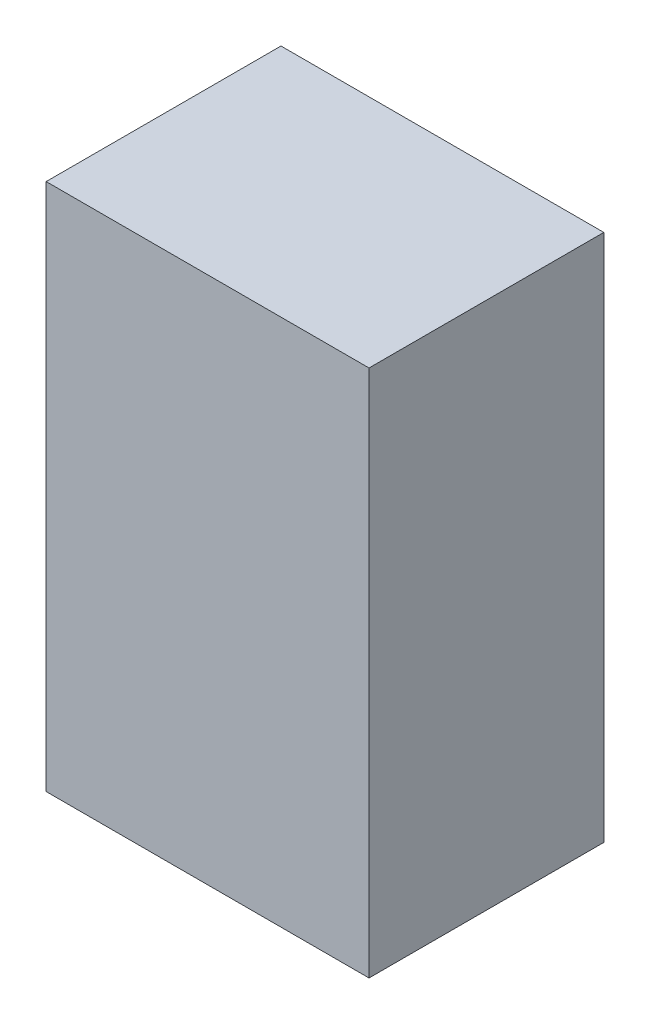
ISO-10303-21;
HEADER;
FILE_DESCRIPTION(('STEP AP214'),'2;1');
FILE_NAME('part.step','',(''),(''),'','','');
FILE_SCHEMA(('AUTOMOTIVE_DESIGN { 1 0 10303 214 1 1 1 1 }'));
ENDSEC;
DATA;
#1=APPLICATION_CONTEXT('core data for automotive mechanical design processes');
#2=APPLICATION_PROTOCOL_DEFINITION('international standard','automotive_design',2000,#1);
#3=PRODUCT_CONTEXT('',#1,'mechanical');
#4=PRODUCT('Part','Part','',(#3));
#5=PRODUCT_RELATED_PRODUCT_CATEGORY('part','',(#4));
#6=PRODUCT_DEFINITION_FORMATION('','',#4);
#7=PRODUCT_DEFINITION_CONTEXT('part definition',#1,'design');
#8=PRODUCT_DEFINITION('design','',#6,#7);
#9=PRODUCT_DEFINITION_SHAPE('','',#8);
#10=(LENGTH_UNIT() NAMED_UNIT(*) SI_UNIT(.MILLI.,.METRE.));
#11=(NAMED_UNIT(*) PLANE_ANGLE_UNIT() SI_UNIT($,.RADIAN.));
#12=(NAMED_UNIT(*) SI_UNIT($,.STERADIAN.) SOLID_ANGLE_UNIT());
#13=UNCERTAINTY_MEASURE_WITH_UNIT(LENGTH_MEASURE(1.E-05),#10,'distance_accuracy_value','');
#14=(GEOMETRIC_REPRESENTATION_CONTEXT(3) GLOBAL_UNCERTAINTY_ASSIGNED_CONTEXT((#13)) GLOBAL_UNIT_ASSIGNED_CONTEXT((#10,
#11,#12)) REPRESENTATION_CONTEXT('',''));
#15=CARTESIAN_POINT('',(0.,0.,0.));
#16=DIRECTION('',(0.,0.,1.));
#17=DIRECTION('',(1.,0.,0.));
#18=AXIS2_PLACEMENT_3D('',#15,#16,#17);
#19=CARTESIAN_POINT('',(0.,0.,7.62));
#20=DIRECTION('',(0.,0.,1.));
#21=DIRECTION('',(1.,0.,0.));
#22=AXIS2_PLACEMENT_3D('',#19,#20,#21);
#23=PLANE('',#22);
#24=DIRECTION('',(0.,-1.,0.));
#25=VECTOR('',#24,1.);
#26=CARTESIAN_POINT('',(1.27000000000001,30.95625,7.62));
#27=LINE('',#26,#25);
#28=CARTESIAN_POINT('',(1.27000000000001,36.03625,7.62));
#29=VERTEX_POINT('',#28);
#30=CARTESIAN_POINT('',(1.27000000000001,-55.40375,7.61999999999999));
#31=VERTEX_POINT('',#30);
#32=EDGE_CURVE('E97',#29,#31,#27,.T.);
#33=ORIENTED_EDGE('',*,*,#32,.F.);
#34=DIRECTION('',(1.,0.,0.));
#35=VECTOR('',#34,1.);
#36=CARTESIAN_POINT('',(-54.61,36.03625,7.62));
#37=LINE('',#36,#35);
#38=CARTESIAN_POINT('',(-54.61,36.03625,7.62));
#39=VERTEX_POINT('',#38);
#40=EDGE_CURVE('E133',#39,#29,#37,.T.);
#41=ORIENTED_EDGE('',*,*,#40,.F.);
#42=DIRECTION('',(0.,1.,0.));
#43=VECTOR('',#42,1.);
#44=CARTESIAN_POINT('',(-54.61,30.95625,7.62));
#45=LINE('',#44,#43);
#46=CARTESIAN_POINT('',(-54.61,-55.40375,7.61999999999999));
#47=VERTEX_POINT('',#46);
#48=EDGE_CURVE('E112',#47,#39,#45,.T.);
#49=ORIENTED_EDGE('',*,*,#48,.F.);
#50=DIRECTION('',(-1.,0.,0.));
#51=VECTOR('',#50,1.);
#52=CARTESIAN_POINT('',(1.27000000000001,-55.40375,7.61999999999999));
#53=LINE('',#52,#51);
#54=EDGE_CURVE('E111',#31,#47,#53,.T.);
#55=ORIENTED_EDGE('',*,*,#54,.F.);
#56=EDGE_LOOP('',(#33,#41,#49,#55));
#57=FACE_BOUND('',#56,.T.);
#58=ADVANCED_FACE('F34',(#57),#23,.T.);
#59=CARTESIAN_POINT('',(0.,0.,0.));
#60=DIRECTION('',(0.,0.,1.));
#61=DIRECTION('',(1.,0.,0.));
#62=AXIS2_PLACEMENT_3D('',#59,#60,#61);
#63=PLANE('',#62);
#64=DIRECTION('',(0.,-1.,0.));
#65=VECTOR('',#64,1.);
#66=CARTESIAN_POINT('',(-49.53,30.95625,0.));
#67=LINE('',#66,#65);
#68=CARTESIAN_POINT('',(-49.53,30.95625,0.));
#69=VERTEX_POINT('',#68);
#70=CARTESIAN_POINT('',(-49.53,-50.32375,0.));
#71=VERTEX_POINT('',#70);
#72=EDGE_CURVE('E49',#69,#71,#67,.T.);
#73=ORIENTED_EDGE('',*,*,#72,.F.);
#74=DIRECTION('',(-1.,0.,0.));
#75=VECTOR('',#74,1.);
#76=CARTESIAN_POINT('',(-49.53,30.95625,0.));
#77=LINE('',#76,#75);
#78=CARTESIAN_POINT('',(-3.80999999999999,30.95625,0.));
#79=VERTEX_POINT('',#78);
#80=EDGE_CURVE('E11',#79,#69,#77,.T.);
#81=ORIENTED_EDGE('',*,*,#80,.F.);
#82=DIRECTION('',(0.,1.,0.));
#83=VECTOR('',#82,1.);
#84=CARTESIAN_POINT('',(-3.80999999999999,30.95625,0.));
#85=LINE('',#84,#83);
#86=CARTESIAN_POINT('',(-3.80999999999999,-50.32375,0.));
#87=VERTEX_POINT('',#86);
#88=EDGE_CURVE('E42',#87,#79,#85,.T.);
#89=ORIENTED_EDGE('',*,*,#88,.F.);
#90=DIRECTION('',(1.,0.,0.));
#91=VECTOR('',#90,1.);
#92=CARTESIAN_POINT('',(-49.53,-50.32375,0.));
#93=LINE('',#92,#91);
#94=EDGE_CURVE('E161',#71,#87,#93,.T.);
#95=ORIENTED_EDGE('',*,*,#94,.F.);
#96=EDGE_LOOP('',(#73,#81,#89,#95));
#97=FACE_BOUND('',#96,.T.);
#98=ADVANCED_FACE('F36',(#97),#63,.F.);
#99=CARTESIAN_POINT('',(-54.61,30.95625,-33.02));
#100=DIRECTION('',(0.,0.,1.));
#101=DIRECTION('',(1.,0.,0.));
#102=AXIS2_PLACEMENT_3D('',#99,#100,#101);
#103=PLANE('',#102);
#104=DIRECTION('',(1.,0.,0.));
#105=VECTOR('',#104,1.);
#106=CARTESIAN_POINT('',(1.27000000000001,-50.32375,-33.02));
#107=LINE('',#106,#105);
#108=CARTESIAN_POINT('',(-49.53,-50.32375,-33.02));
#109=VERTEX_POINT('',#108);
#110=CARTESIAN_POINT('',(-3.80999999999999,-50.32375,-33.02));
#111=VERTEX_POINT('',#110);
#112=EDGE_CURVE('E122',#109,#111,#107,.T.);
#113=ORIENTED_EDGE('',*,*,#112,.T.);
#114=DIRECTION('',(0.,1.,0.));
#115=VECTOR('',#114,1.);
#116=CARTESIAN_POINT('',(-3.80999999999999,30.95625,-33.02));
#117=LINE('',#116,#115);
#118=CARTESIAN_POINT('',(-3.80999999999999,30.95625,-33.02));
#119=VERTEX_POINT('',#118);
#120=EDGE_CURVE('E146',#111,#119,#117,.T.);
#121=ORIENTED_EDGE('',*,*,#120,.T.);
#122=DIRECTION('',(-1.,0.,0.));
#123=VECTOR('',#122,1.);
#124=CARTESIAN_POINT('',(-54.61,30.95625,-33.02));
#125=LINE('',#124,#123);
#126=CARTESIAN_POINT('',(-49.53,30.95625,-33.02));
#127=VERTEX_POINT('',#126);
#128=EDGE_CURVE('E128',#119,#127,#125,.T.);
#129=ORIENTED_EDGE('',*,*,#128,.T.);
#130=DIRECTION('',(0.,-1.,0.));
#131=VECTOR('',#130,1.);
#132=CARTESIAN_POINT('',(-49.53,30.95625,-33.02));
#133=LINE('',#132,#131);
#134=EDGE_CURVE('E156',#127,#109,#133,.T.);
#135=ORIENTED_EDGE('',*,*,#134,.T.);
#136=EDGE_LOOP('',(#113,#121,#129,#135));
#137=FACE_BOUND('',#136,.T.);
#138=DIRECTION('',(0.,1.,0.));
#139=VECTOR('',#138,1.);
#140=CARTESIAN_POINT('',(1.27000000000001,30.95625,-33.02));
#141=LINE('',#140,#139);
#142=CARTESIAN_POINT('',(1.27000000000001,-55.40375,-33.02));
#143=VERTEX_POINT('',#142);
#144=CARTESIAN_POINT('',(1.27000000000001,36.03625,-33.02));
#145=VERTEX_POINT('',#144);
#146=EDGE_CURVE('E107',#143,#145,#141,.T.);
#147=ORIENTED_EDGE('',*,*,#146,.F.);
#148=DIRECTION('',(1.,0.,0.));
#149=VECTOR('',#148,1.);
#150=CARTESIAN_POINT('',(1.27000000000001,-55.40375,-33.02));
#151=LINE('',#150,#149);
#152=CARTESIAN_POINT('',(-54.61,-55.40375,-33.02));
#153=VERTEX_POINT('',#152);
#154=EDGE_CURVE('E121',#153,#143,#151,.T.);
#155=ORIENTED_EDGE('',*,*,#154,.F.);
#156=DIRECTION('',(0.,-1.,0.));
#157=VECTOR('',#156,1.);
#158=CARTESIAN_POINT('',(-54.61,30.95625,-33.02));
#159=LINE('',#158,#157);
#160=CARTESIAN_POINT('',(-54.61,36.03625,-33.02));
#161=VERTEX_POINT('',#160);
#162=EDGE_CURVE('E151',#161,#153,#159,.T.);
#163=ORIENTED_EDGE('',*,*,#162,.F.);
#164=DIRECTION('',(-1.,0.,0.));
#165=VECTOR('',#164,1.);
#166=CARTESIAN_POINT('',(-54.61,36.03625,-33.02));
#167=LINE('',#166,#165);
#168=EDGE_CURVE('E136',#145,#161,#167,.T.);
#169=ORIENTED_EDGE('',*,*,#168,.F.);
#170=EDGE_LOOP('',(#147,#155,#163,#169));
#171=FACE_BOUND('',#170,.T.);
#172=ADVANCED_FACE('F170',(#137,#171),#103,.F.);
#173=CARTESIAN_POINT('',(-54.61,0.,0.));
#174=DIRECTION('',(1.,0.,0.));
#175=DIRECTION('',(0.,1.,0.));
#176=AXIS2_PLACEMENT_3D('',#173,#174,#175);
#177=PLANE('',#176);
#178=ORIENTED_EDGE('',*,*,#48,.T.);
#179=DIRECTION('',(0.,0.,1.));
#180=VECTOR('',#179,1.);
#181=CARTESIAN_POINT('',(-54.61,36.03625,7.62));
#182=LINE('',#181,#180);
#183=EDGE_CURVE('E130',#161,#39,#182,.T.);
#184=ORIENTED_EDGE('',*,*,#183,.F.);
#185=ORIENTED_EDGE('',*,*,#162,.T.);
#186=DIRECTION('',(0.,0.,-1.));
#187=VECTOR('',#186,1.);
#188=CARTESIAN_POINT('',(-54.61,-55.40375,7.61999999999999));
#189=LINE('',#188,#187);
#190=EDGE_CURVE('E116',#47,#153,#189,.T.);
#191=ORIENTED_EDGE('',*,*,#190,.F.);
#192=EDGE_LOOP('',(#178,#184,#185,#191));
#193=FACE_BOUND('',#192,.T.);
#194=ADVANCED_FACE('F179',(#193),#177,.F.);
#195=CARTESIAN_POINT('',(-49.53,0.,0.));
#196=DIRECTION('',(1.,0.,0.));
#197=DIRECTION('',(0.,1.,0.));
#198=AXIS2_PLACEMENT_3D('',#195,#196,#197);
#199=PLANE('',#198);
#200=DIRECTION('',(0.,0.,-1.));
#201=VECTOR('',#200,1.);
#202=CARTESIAN_POINT('',(-49.53,30.95625,7.62));
#203=LINE('',#202,#201);
#204=EDGE_CURVE('E143',#69,#127,#203,.T.);
#205=ORIENTED_EDGE('',*,*,#204,.F.);
#206=ORIENTED_EDGE('',*,*,#72,.T.);
#207=DIRECTION('',(0.,0.,1.));
#208=VECTOR('',#207,1.);
#209=CARTESIAN_POINT('',(-49.53,-50.32375,7.62000000000001));
#210=LINE('',#209,#208);
#211=EDGE_CURVE('E152',#109,#71,#210,.T.);
#212=ORIENTED_EDGE('',*,*,#211,.F.);
#213=ORIENTED_EDGE('',*,*,#134,.F.);
#214=EDGE_LOOP('',(#205,#206,#212,#213));
#215=FACE_BOUND('',#214,.T.);
#216=ADVANCED_FACE('F177',(#215),#199,.T.);
#217=CARTESIAN_POINT('',(-3.80999999999999,0.,0.));
#218=DIRECTION('',(1.,0.,0.));
#219=DIRECTION('',(0.,1.,0.));
#220=AXIS2_PLACEMENT_3D('',#217,#218,#219);
#221=PLANE('',#220);
#222=DIRECTION('',(0.,0.,-1.));
#223=VECTOR('',#222,1.);
#224=CARTESIAN_POINT('',(-3.80999999999999,-50.32375,7.61999999999999));
#225=LINE('',#224,#223);
#226=EDGE_CURVE('E139',#87,#111,#225,.T.);
#227=ORIENTED_EDGE('',*,*,#226,.F.);
#228=ORIENTED_EDGE('',*,*,#88,.T.);
#229=DIRECTION('',(0.,0.,1.));
#230=VECTOR('',#229,1.);
#231=CARTESIAN_POINT('',(-3.80999999999999,30.95625,7.62));
#232=LINE('',#231,#230);
#233=EDGE_CURVE('E108',#119,#79,#232,.T.);
#234=ORIENTED_EDGE('',*,*,#233,.F.);
#235=ORIENTED_EDGE('',*,*,#120,.F.);
#236=EDGE_LOOP('',(#227,#228,#234,#235));
#237=FACE_BOUND('',#236,.T.);
#238=ADVANCED_FACE('F165',(#237),#221,.F.);
#239=CARTESIAN_POINT('',(1.27000000000001,0.,0.));
#240=DIRECTION('',(1.,0.,0.));
#241=DIRECTION('',(0.,1.,0.));
#242=AXIS2_PLACEMENT_3D('',#239,#240,#241);
#243=PLANE('',#242);
#244=ORIENTED_EDGE('',*,*,#32,.T.);
#245=DIRECTION('',(0.,0.,1.));
#246=VECTOR('',#245,1.);
#247=CARTESIAN_POINT('',(1.27000000000001,-55.40375,7.61999999999999));
#248=LINE('',#247,#246);
#249=EDGE_CURVE('E101',#143,#31,#248,.T.);
#250=ORIENTED_EDGE('',*,*,#249,.F.);
#251=ORIENTED_EDGE('',*,*,#146,.T.);
#252=DIRECTION('',(0.,0.,-1.));
#253=VECTOR('',#252,1.);
#254=CARTESIAN_POINT('',(1.27000000000001,36.03625,7.62));
#255=LINE('',#254,#253);
#256=EDGE_CURVE('E103',#29,#145,#255,.T.);
#257=ORIENTED_EDGE('',*,*,#256,.F.);
#258=EDGE_LOOP('',(#244,#250,#251,#257));
#259=FACE_BOUND('',#258,.T.);
#260=ADVANCED_FACE('F99',(#259),#243,.T.);
#261=CARTESIAN_POINT('',(0.,36.03625,0.));
#262=DIRECTION('',(0.,-1.,0.));
#263=DIRECTION('',(0.,0.,-1.));
#264=AXIS2_PLACEMENT_3D('',#261,#262,#263);
#265=PLANE('',#264);
#266=ORIENTED_EDGE('',*,*,#183,.T.);
#267=ORIENTED_EDGE('',*,*,#40,.T.);
#268=ORIENTED_EDGE('',*,*,#256,.T.);
#269=ORIENTED_EDGE('',*,*,#168,.T.);
#270=EDGE_LOOP('',(#266,#267,#268,#269));
#271=FACE_BOUND('',#270,.T.);
#272=ADVANCED_FACE('F225',(#271),#265,.F.);
#273=CARTESIAN_POINT('',(0.,30.95625,0.));
#274=DIRECTION('',(0.,-1.,0.));
#275=DIRECTION('',(0.,0.,-1.));
#276=AXIS2_PLACEMENT_3D('',#273,#274,#275);
#277=PLANE('',#276);
#278=ORIENTED_EDGE('',*,*,#80,.T.);
#279=ORIENTED_EDGE('',*,*,#204,.T.);
#280=ORIENTED_EDGE('',*,*,#128,.F.);
#281=ORIENTED_EDGE('',*,*,#233,.T.);
#282=EDGE_LOOP('',(#278,#279,#280,#281));
#283=FACE_BOUND('',#282,.T.);
#284=ADVANCED_FACE('F168',(#283),#277,.T.);
#285=CARTESIAN_POINT('',(0.,-55.40375,0.));
#286=DIRECTION('',(0.,1.,0.));
#287=DIRECTION('',(0.,0.,1.));
#288=AXIS2_PLACEMENT_3D('',#285,#286,#287);
#289=PLANE('',#288);
#290=ORIENTED_EDGE('',*,*,#249,.T.);
#291=ORIENTED_EDGE('',*,*,#54,.T.);
#292=ORIENTED_EDGE('',*,*,#190,.T.);
#293=ORIENTED_EDGE('',*,*,#154,.T.);
#294=EDGE_LOOP('',(#290,#291,#292,#293));
#295=FACE_BOUND('',#294,.T.);
#296=ADVANCED_FACE('F119',(#295),#289,.F.);
#297=CARTESIAN_POINT('',(0.,-50.32375,0.));
#298=DIRECTION('',(0.,1.,0.));
#299=DIRECTION('',(0.,0.,1.));
#300=AXIS2_PLACEMENT_3D('',#297,#298,#299);
#301=PLANE('',#300);
#302=ORIENTED_EDGE('',*,*,#94,.T.);
#303=ORIENTED_EDGE('',*,*,#226,.T.);
#304=ORIENTED_EDGE('',*,*,#112,.F.);
#305=ORIENTED_EDGE('',*,*,#211,.T.);
#306=EDGE_LOOP('',(#302,#303,#304,#305));
#307=FACE_BOUND('',#306,.T.);
#308=ADVANCED_FACE('F175',(#307),#301,.T.);
#309=CLOSED_SHELL('',(#58,#98,#172,#194,#216,#238,#260,#272,#284,#296,#308));
#310=MANIFOLD_SOLID_BREP('B2',#309);
#311=ADVANCED_BREP_SHAPE_REPRESENTATION('',(#18,#310),#14);
#312=SHAPE_DEFINITION_REPRESENTATION(#9,#311);
ENDSEC;
END-ISO-10303-21;
